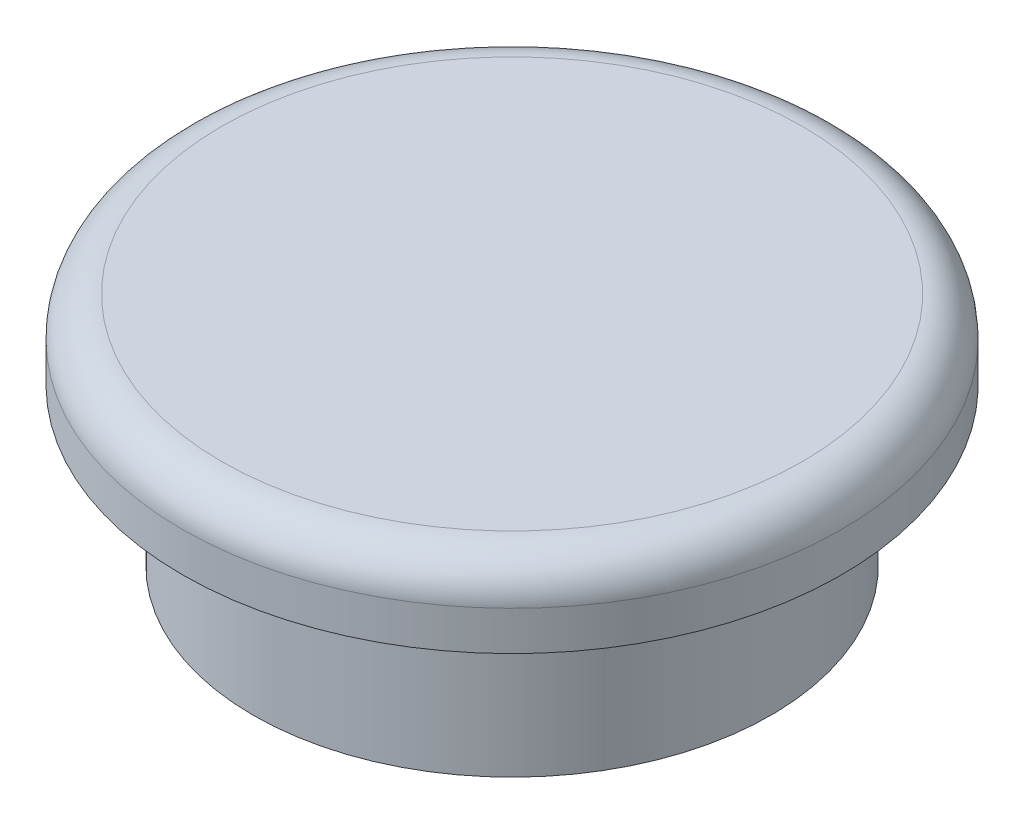
ISO-10303-21;
HEADER;
FILE_DESCRIPTION(('STEP AP214'),'2;1');
FILE_NAME('part.step','',(''),(''),'','','');
FILE_SCHEMA(('AUTOMOTIVE_DESIGN { 1 0 10303 214 1 1 1 1 }'));
ENDSEC;
DATA;
#1=APPLICATION_CONTEXT('core data for automotive mechanical design processes');
#2=APPLICATION_PROTOCOL_DEFINITION('international standard','automotive_design',2000,#1);
#3=PRODUCT_CONTEXT('',#1,'mechanical');
#4=PRODUCT('Part','Part','',(#3));
#5=PRODUCT_RELATED_PRODUCT_CATEGORY('part','',(#4));
#6=PRODUCT_DEFINITION_FORMATION('','',#4);
#7=PRODUCT_DEFINITION_CONTEXT('part definition',#1,'design');
#8=PRODUCT_DEFINITION('design','',#6,#7);
#9=PRODUCT_DEFINITION_SHAPE('','',#8);
#10=(LENGTH_UNIT() NAMED_UNIT(*) SI_UNIT(.MILLI.,.METRE.));
#11=(NAMED_UNIT(*) PLANE_ANGLE_UNIT() SI_UNIT($,.RADIAN.));
#12=(NAMED_UNIT(*) SI_UNIT($,.STERADIAN.) SOLID_ANGLE_UNIT());
#13=UNCERTAINTY_MEASURE_WITH_UNIT(LENGTH_MEASURE(1.E-05),#10,'distance_accuracy_value','');
#14=(GEOMETRIC_REPRESENTATION_CONTEXT(3) GLOBAL_UNCERTAINTY_ASSIGNED_CONTEXT((#13)) GLOBAL_UNIT_ASSIGNED_CONTEXT((#10,
#11,#12)) REPRESENTATION_CONTEXT('',''));
#15=CARTESIAN_POINT('',(0.,0.,0.));
#16=DIRECTION('',(0.,0.,1.));
#17=DIRECTION('',(1.,0.,0.));
#18=AXIS2_PLACEMENT_3D('',#15,#16,#17);
#19=CARTESIAN_POINT('',(0.,6.35,0.));
#20=DIRECTION('',(0.,-1.,0.));
#21=DIRECTION('',(0.,0.,-1.));
#22=AXIS2_PLACEMENT_3D('',#19,#20,#21);
#23=CYLINDRICAL_SURFACE('',#22,10.4775);
#24=CARTESIAN_POINT('',(0.,6.35,0.));
#25=DIRECTION('',(0.,1.,0.));
#26=DIRECTION('',(0.,0.,1.));
#27=AXIS2_PLACEMENT_3D('',#24,#25,#26);
#28=CIRCLE('',#27,10.4775);
#29=CARTESIAN_POINT('',(0.,6.35,10.4775));
#30=VERTEX_POINT('',#29);
#31=EDGE_CURVE('E43',#30,#30,#28,.T.);
#32=ORIENTED_EDGE('',*,*,#31,.F.);
#33=EDGE_LOOP('',(#32));
#34=FACE_BOUND('',#33,.T.);
#35=CARTESIAN_POINT('',(0.,0.,0.));
#36=DIRECTION('',(0.,1.,0.));
#37=DIRECTION('',(0.,0.,1.));
#38=AXIS2_PLACEMENT_3D('',#35,#36,#37);
#39=CIRCLE('',#38,10.4775);
#40=CARTESIAN_POINT('',(0.,0.,10.4775));
#41=VERTEX_POINT('',#40);
#42=EDGE_CURVE('E47',#41,#41,#39,.T.);
#43=ORIENTED_EDGE('',*,*,#42,.T.);
#44=EDGE_LOOP('',(#43));
#45=FACE_BOUND('',#44,.T.);
#46=ADVANCED_FACE('F32',(#34,#45),#23,.T.);
#47=CARTESIAN_POINT('',(0.,0.,0.));
#48=DIRECTION('',(0.,1.,0.));
#49=DIRECTION('',(0.,0.,1.));
#50=AXIS2_PLACEMENT_3D('',#47,#48,#49);
#51=PLANE('',#50);
#52=ORIENTED_EDGE('',*,*,#42,.F.);
#53=EDGE_LOOP('',(#52));
#54=FACE_BOUND('',#53,.T.);
#55=ADVANCED_FACE('F61',(#54),#51,.F.);
#56=CARTESIAN_POINT('',(0.,6.35,0.));
#57=DIRECTION('',(0.,1.,0.));
#58=DIRECTION('',(0.,0.,1.));
#59=AXIS2_PLACEMENT_3D('',#56,#57,#58);
#60=PLANE('',#59);
#61=CARTESIAN_POINT('',(0.,6.35,0.));
#62=DIRECTION('',(0.,1.,0.));
#63=DIRECTION('',(0.,0.,1.));
#64=AXIS2_PLACEMENT_3D('',#61,#62,#63);
#65=CIRCLE('',#64,13.335);
#66=CARTESIAN_POINT('',(0.,6.35,13.335));
#67=VERTEX_POINT('',#66);
#68=EDGE_CURVE('E51',#67,#67,#65,.T.);
#69=ORIENTED_EDGE('',*,*,#68,.F.);
#70=EDGE_LOOP('',(#69));
#71=FACE_BOUND('',#70,.T.);
#72=ORIENTED_EDGE('',*,*,#31,.T.);
#73=EDGE_LOOP('',(#72));
#74=FACE_BOUND('',#73,.T.);
#75=ADVANCED_FACE('F58',(#71,#74),#60,.F.);
#76=CARTESIAN_POINT('',(0.,9.525,0.));
#77=DIRECTION('',(0.,-1.,0.));
#78=DIRECTION('',(0.,0.,-1.));
#79=AXIS2_PLACEMENT_3D('',#76,#77,#78);
#80=CYLINDRICAL_SURFACE('',#79,13.335);
#81=CARTESIAN_POINT('',(0.,7.9375,0.));
#82=DIRECTION('',(0.,1.,0.));
#83=DIRECTION('',(0.,0.,1.));
#84=AXIS2_PLACEMENT_3D('',#81,#82,#83);
#85=CIRCLE('',#84,13.335);
#86=CARTESIAN_POINT('',(0.,7.9375,13.335));
#87=VERTEX_POINT('',#86);
#88=EDGE_CURVE('E10',#87,#87,#85,.F.);
#89=ORIENTED_EDGE('',*,*,#88,.T.);
#90=EDGE_LOOP('',(#89));
#91=FACE_BOUND('',#90,.T.);
#92=ORIENTED_EDGE('',*,*,#68,.T.);
#93=EDGE_LOOP('',(#92));
#94=FACE_BOUND('',#93,.T.);
#95=ADVANCED_FACE('F56',(#91,#94),#80,.T.);
#96=CARTESIAN_POINT('',(0.,9.525,0.));
#97=DIRECTION('',(0.,1.,0.));
#98=DIRECTION('',(0.,0.,1.));
#99=AXIS2_PLACEMENT_3D('',#96,#97,#98);
#100=PLANE('',#99);
#101=CARTESIAN_POINT('',(0.,9.525,0.));
#102=DIRECTION('',(0.,1.,0.));
#103=DIRECTION('',(0.,0.,1.));
#104=AXIS2_PLACEMENT_3D('',#101,#102,#103);
#105=CIRCLE('',#104,11.7475);
#106=CARTESIAN_POINT('',(0.,9.525,11.7475));
#107=VERTEX_POINT('',#106);
#108=EDGE_CURVE('E39',#107,#107,#105,.T.);
#109=ORIENTED_EDGE('',*,*,#108,.T.);
#110=EDGE_LOOP('',(#109));
#111=FACE_BOUND('',#110,.T.);
#112=ADVANCED_FACE('F75',(#111),#100,.T.);
#113=CARTESIAN_POINT('',(0.,7.9375,0.));
#114=DIRECTION('',(0.,1.,0.));
#115=DIRECTION('',(0.,0.,1.));
#116=AXIS2_PLACEMENT_3D('',#113,#114,#115);
#117=TOROIDAL_SURFACE('',#116,11.7475,1.5875);
#118=ORIENTED_EDGE('',*,*,#88,.F.);
#119=EDGE_LOOP('',(#118));
#120=FACE_BOUND('',#119,.T.);
#121=ORIENTED_EDGE('',*,*,#108,.F.);
#122=EDGE_LOOP('',(#121));
#123=FACE_BOUND('',#122,.T.);
#124=ADVANCED_FACE('F34',(#120,#123),#117,.T.);
#125=CLOSED_SHELL('',(#46,#55,#75,#95,#112,#124));
#126=MANIFOLD_SOLID_BREP('B2',#125);
#127=ADVANCED_BREP_SHAPE_REPRESENTATION('',(#18,#126),#14);
#128=SHAPE_DEFINITION_REPRESENTATION(#9,#127);
ENDSEC;
END-ISO-10303-21;
